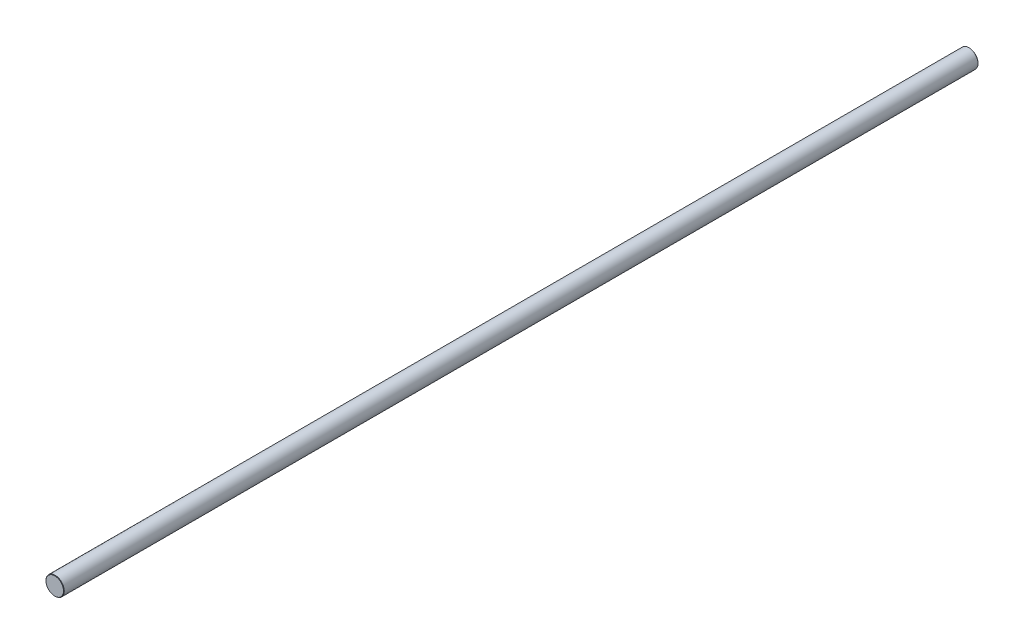
ISO-10303-21;
HEADER;
FILE_DESCRIPTION(('STEP AP214'),'2;1');
FILE_NAME('part.step','',(''),(''),'','','');
FILE_SCHEMA(('AUTOMOTIVE_DESIGN { 1 0 10303 214 1 1 1 1 }'));
ENDSEC;
DATA;
#1=APPLICATION_CONTEXT('core data for automotive mechanical design processes');
#2=APPLICATION_PROTOCOL_DEFINITION('international standard','automotive_design',2000,#1);
#3=PRODUCT_CONTEXT('',#1,'mechanical');
#4=PRODUCT('Part','Part','',(#3));
#5=PRODUCT_RELATED_PRODUCT_CATEGORY('part','',(#4));
#6=PRODUCT_DEFINITION_FORMATION('','',#4);
#7=PRODUCT_DEFINITION_CONTEXT('part definition',#1,'design');
#8=PRODUCT_DEFINITION('design','',#6,#7);
#9=PRODUCT_DEFINITION_SHAPE('','',#8);
#10=(LENGTH_UNIT() NAMED_UNIT(*) SI_UNIT(.MILLI.,.METRE.));
#11=(NAMED_UNIT(*) PLANE_ANGLE_UNIT() SI_UNIT($,.RADIAN.));
#12=(NAMED_UNIT(*) SI_UNIT($,.STERADIAN.) SOLID_ANGLE_UNIT());
#13=UNCERTAINTY_MEASURE_WITH_UNIT(LENGTH_MEASURE(1.E-05),#10,'distance_accuracy_value','');
#14=(GEOMETRIC_REPRESENTATION_CONTEXT(3) GLOBAL_UNCERTAINTY_ASSIGNED_CONTEXT((#13)) GLOBAL_UNIT_ASSIGNED_CONTEXT((#10,
#11,#12)) REPRESENTATION_CONTEXT('',''));
#15=CARTESIAN_POINT('',(0.,0.,0.));
#16=DIRECTION('',(0.,0.,1.));
#17=DIRECTION('',(1.,0.,0.));
#18=AXIS2_PLACEMENT_3D('',#15,#16,#17);
#19=CARTESIAN_POINT('',(0.,0.,200.));
#20=DIRECTION('',(0.,0.,-1.));
#21=DIRECTION('',(-1.,0.,0.));
#22=AXIS2_PLACEMENT_3D('',#19,#20,#21);
#23=CYLINDRICAL_SURFACE('',#22,4.);
#24=CARTESIAN_POINT('',(0.,0.,-199.84));
#25=DIRECTION('',(0.,0.,1.));
#26=DIRECTION('',(1.,0.,0.));
#27=AXIS2_PLACEMENT_3D('',#24,#25,#26);
#28=CIRCLE('',#27,4.);
#29=CARTESIAN_POINT('',(4.,0.,-199.84));
#30=VERTEX_POINT('',#29);
#31=EDGE_CURVE('E41',#30,#30,#28,.T.);
#32=ORIENTED_EDGE('',*,*,#31,.T.);
#33=EDGE_LOOP('',(#32));
#34=FACE_BOUND('',#33,.T.);
#35=CARTESIAN_POINT('',(0.,0.,199.84));
#36=DIRECTION('',(0.,0.,1.));
#37=DIRECTION('',(1.,0.,0.));
#38=AXIS2_PLACEMENT_3D('',#35,#36,#37);
#39=CIRCLE('',#38,4.);
#40=CARTESIAN_POINT('',(4.,0.,199.84));
#41=VERTEX_POINT('',#40);
#42=EDGE_CURVE('E45',#41,#41,#39,.F.);
#43=ORIENTED_EDGE('',*,*,#42,.T.);
#44=EDGE_LOOP('',(#43));
#45=FACE_BOUND('',#44,.T.);
#46=ADVANCED_FACE('F30',(#34,#45),#23,.T.);
#47=CARTESIAN_POINT('',(0.,0.,200.));
#48=DIRECTION('',(0.,0.,1.));
#49=DIRECTION('',(1.,0.,0.));
#50=AXIS2_PLACEMENT_3D('',#47,#48,#49);
#51=PLANE('',#50);
#52=CARTESIAN_POINT('',(0.,0.,200.));
#53=DIRECTION('',(0.,0.,1.));
#54=DIRECTION('',(1.,0.,0.));
#55=AXIS2_PLACEMENT_3D('',#52,#53,#54);
#56=CIRCLE('',#55,3.84000000000001);
#57=CARTESIAN_POINT('',(3.84000000000001,0.,200.));
#58=VERTEX_POINT('',#57);
#59=EDGE_CURVE('E10',#58,#58,#56,.T.);
#60=ORIENTED_EDGE('',*,*,#59,.T.);
#61=EDGE_LOOP('',(#60));
#62=FACE_BOUND('',#61,.T.);
#63=ADVANCED_FACE('F61',(#62),#51,.T.);
#64=CARTESIAN_POINT('',(0.,0.,-200.));
#65=DIRECTION('',(0.,0.,1.));
#66=DIRECTION('',(1.,0.,0.));
#67=AXIS2_PLACEMENT_3D('',#64,#65,#66);
#68=PLANE('',#67);
#69=CARTESIAN_POINT('',(0.,0.,-200.));
#70=DIRECTION('',(0.,0.,1.));
#71=DIRECTION('',(1.,0.,0.));
#72=AXIS2_PLACEMENT_3D('',#69,#70,#71);
#73=CIRCLE('',#72,3.83999999999995);
#74=CARTESIAN_POINT('',(3.83999999999995,0.,-200.));
#75=VERTEX_POINT('',#74);
#76=EDGE_CURVE('E37',#75,#75,#73,.F.);
#77=ORIENTED_EDGE('',*,*,#76,.T.);
#78=EDGE_LOOP('',(#77));
#79=FACE_BOUND('',#78,.T.);
#80=ADVANCED_FACE('F58',(#79),#68,.F.);
#81=CARTESIAN_POINT('',(0.,0.,-199.84));
#82=DIRECTION('',(0.,0.,1.));
#83=DIRECTION('',(1.,0.,0.));
#84=AXIS2_PLACEMENT_3D('',#81,#82,#83);
#85=CONICAL_SURFACE('',#84,4.,0.785398163397611);
#86=ORIENTED_EDGE('',*,*,#76,.F.);
#87=EDGE_LOOP('',(#86));
#88=FACE_BOUND('',#87,.T.);
#89=ORIENTED_EDGE('',*,*,#31,.F.);
#90=EDGE_LOOP('',(#89));
#91=FACE_BOUND('',#90,.T.);
#92=ADVANCED_FACE('F54',(#88,#91),#85,.T.);
#93=CARTESIAN_POINT('',(0.,0.,200.));
#94=DIRECTION('',(0.,0.,-1.));
#95=DIRECTION('',(-1.,0.,0.));
#96=AXIS2_PLACEMENT_3D('',#93,#94,#95);
#97=CONICAL_SURFACE('',#96,3.84000000000001,0.785398163397524);
#98=ORIENTED_EDGE('',*,*,#42,.F.);
#99=EDGE_LOOP('',(#98));
#100=FACE_BOUND('',#99,.T.);
#101=ORIENTED_EDGE('',*,*,#59,.F.);
#102=EDGE_LOOP('',(#101));
#103=FACE_BOUND('',#102,.T.);
#104=ADVANCED_FACE('F32',(#100,#103),#97,.T.);
#105=CLOSED_SHELL('',(#46,#63,#80,#92,#104));
#106=MANIFOLD_SOLID_BREP('B2',#105);
#107=ADVANCED_BREP_SHAPE_REPRESENTATION('',(#18,#106),#14);
#108=SHAPE_DEFINITION_REPRESENTATION(#9,#107);
ENDSEC;
END-ISO-10303-21;
